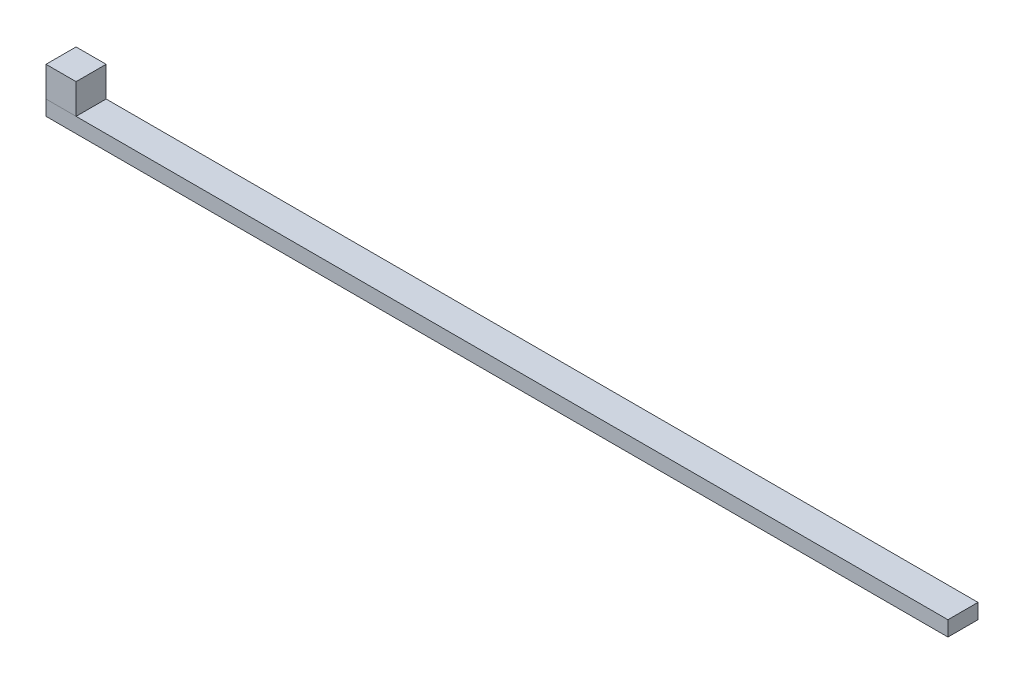
ISO-10303-21;
HEADER;
FILE_DESCRIPTION(('STEP AP214'),'2;1');
FILE_NAME('part.step','',(''),(''),'','','');
FILE_SCHEMA(('AUTOMOTIVE_DESIGN { 1 0 10303 214 1 1 1 1 }'));
ENDSEC;
DATA;
#1=APPLICATION_CONTEXT('core data for automotive mechanical design processes');
#2=APPLICATION_PROTOCOL_DEFINITION('international standard','automotive_design',2000,#1);
#3=PRODUCT_CONTEXT('',#1,'mechanical');
#4=PRODUCT('Part','Part','',(#3));
#5=PRODUCT_RELATED_PRODUCT_CATEGORY('part','',(#4));
#6=PRODUCT_DEFINITION_FORMATION('','',#4);
#7=PRODUCT_DEFINITION_CONTEXT('part definition',#1,'design');
#8=PRODUCT_DEFINITION('design','',#6,#7);
#9=PRODUCT_DEFINITION_SHAPE('','',#8);
#10=(LENGTH_UNIT() NAMED_UNIT(*) SI_UNIT(.MILLI.,.METRE.));
#11=(NAMED_UNIT(*) PLANE_ANGLE_UNIT() SI_UNIT($,.RADIAN.));
#12=(NAMED_UNIT(*) SI_UNIT($,.STERADIAN.) SOLID_ANGLE_UNIT());
#13=UNCERTAINTY_MEASURE_WITH_UNIT(LENGTH_MEASURE(1.E-05),#10,'distance_accuracy_value','');
#14=(GEOMETRIC_REPRESENTATION_CONTEXT(3) GLOBAL_UNCERTAINTY_ASSIGNED_CONTEXT((#13)) GLOBAL_UNIT_ASSIGNED_CONTEXT((#10,
#11,#12)) REPRESENTATION_CONTEXT('',''));
#15=CARTESIAN_POINT('',(0.,0.,0.));
#16=DIRECTION('',(0.,0.,1.));
#17=DIRECTION('',(1.,0.,0.));
#18=AXIS2_PLACEMENT_3D('',#15,#16,#17);
#19=CARTESIAN_POINT('',(0.,0.,100.));
#20=DIRECTION('',(0.,1.,0.));
#21=DIRECTION('',(0.,0.,1.));
#22=AXIS2_PLACEMENT_3D('',#19,#20,#21);
#23=PLANE('',#22);
#24=DIRECTION('',(1.,0.,0.));
#25=VECTOR('',#24,1.);
#26=CARTESIAN_POINT('',(0.,0.,0.));
#27=LINE('',#26,#25);
#28=CARTESIAN_POINT('',(0.,0.,0.));
#29=VERTEX_POINT('',#28);
#30=CARTESIAN_POINT('',(100.,0.,0.));
#31=VERTEX_POINT('',#30);
#32=EDGE_CURVE('E116',#29,#31,#27,.T.);
#33=ORIENTED_EDGE('',*,*,#32,.T.);
#34=DIRECTION('',(0.,0.,-1.));
#35=VECTOR('',#34,1.);
#36=CARTESIAN_POINT('',(100.,0.,100.));
#37=LINE('',#36,#35);
#38=CARTESIAN_POINT('',(100.,0.,100.));
#39=VERTEX_POINT('',#38);
#40=EDGE_CURVE('E12',#39,#31,#37,.T.);
#41=ORIENTED_EDGE('',*,*,#40,.F.);
#42=DIRECTION('',(1.,0.,0.));
#43=VECTOR('',#42,1.);
#44=CARTESIAN_POINT('',(0.,0.,100.));
#45=LINE('',#44,#43);
#46=CARTESIAN_POINT('',(0.,0.,100.));
#47=VERTEX_POINT('',#46);
#48=EDGE_CURVE('E102',#47,#39,#45,.T.);
#49=ORIENTED_EDGE('',*,*,#48,.F.);
#50=DIRECTION('',(0.,0.,-1.));
#51=VECTOR('',#50,1.);
#52=CARTESIAN_POINT('',(0.,0.,100.));
#53=LINE('',#52,#51);
#54=EDGE_CURVE('E69',#47,#29,#53,.T.);
#55=ORIENTED_EDGE('',*,*,#54,.T.);
#56=EDGE_LOOP('',(#33,#41,#49,#55));
#57=FACE_BOUND('',#56,.T.);
#58=ADVANCED_FACE('F53',(#57),#23,.F.);
#59=CARTESIAN_POINT('',(100.,0.,100.));
#60=DIRECTION('',(-1.,0.,0.));
#61=DIRECTION('',(0.,0.,1.));
#62=AXIS2_PLACEMENT_3D('',#59,#60,#61);
#63=PLANE('',#62);
#64=DIRECTION('',(0.,1.,0.));
#65=VECTOR('',#64,1.);
#66=CARTESIAN_POINT('',(100.,0.,0.));
#67=LINE('',#66,#65);
#68=CARTESIAN_POINT('',(100.,100.,0.));
#69=VERTEX_POINT('',#68);
#70=EDGE_CURVE('E107',#31,#69,#67,.T.);
#71=ORIENTED_EDGE('',*,*,#70,.T.);
#72=DIRECTION('',(0.,0.,-1.));
#73=VECTOR('',#72,1.);
#74=CARTESIAN_POINT('',(100.,100.,100.));
#75=LINE('',#74,#73);
#76=CARTESIAN_POINT('',(100.,100.,100.));
#77=VERTEX_POINT('',#76);
#78=EDGE_CURVE('E61',#77,#69,#75,.T.);
#79=ORIENTED_EDGE('',*,*,#78,.F.);
#80=DIRECTION('',(0.,1.,0.));
#81=VECTOR('',#80,1.);
#82=CARTESIAN_POINT('',(100.,0.,100.));
#83=LINE('',#82,#81);
#84=EDGE_CURVE('E94',#39,#77,#83,.T.);
#85=ORIENTED_EDGE('',*,*,#84,.F.);
#86=ORIENTED_EDGE('',*,*,#40,.T.);
#87=EDGE_LOOP('',(#71,#79,#85,#86));
#88=FACE_BOUND('',#87,.T.);
#89=ADVANCED_FACE('F106',(#88),#63,.F.);
#90=CARTESIAN_POINT('',(0.,100.,100.));
#91=DIRECTION('',(0.,1.,0.));
#92=DIRECTION('',(0.,0.,1.));
#93=AXIS2_PLACEMENT_3D('',#90,#91,#92);
#94=PLANE('',#93);
#95=DIRECTION('',(1.,0.,0.));
#96=VECTOR('',#95,1.);
#97=CARTESIAN_POINT('',(0.,100.,0.));
#98=LINE('',#97,#96);
#99=CARTESIAN_POINT('',(0.,100.,0.));
#100=VERTEX_POINT('',#99);
#101=EDGE_CURVE('E119',#100,#69,#98,.T.);
#102=ORIENTED_EDGE('',*,*,#101,.F.);
#103=DIRECTION('',(0.,0.,-1.));
#104=VECTOR('',#103,1.);
#105=CARTESIAN_POINT('',(0.,100.,100.));
#106=LINE('',#105,#104);
#107=CARTESIAN_POINT('',(0.,100.,100.));
#108=VERTEX_POINT('',#107);
#109=EDGE_CURVE('E83',#108,#100,#106,.T.);
#110=ORIENTED_EDGE('',*,*,#109,.F.);
#111=DIRECTION('',(1.,0.,0.));
#112=VECTOR('',#111,1.);
#113=CARTESIAN_POINT('',(0.,100.,100.));
#114=LINE('',#113,#112);
#115=EDGE_CURVE('E101',#108,#77,#114,.T.);
#116=ORIENTED_EDGE('',*,*,#115,.T.);
#117=ORIENTED_EDGE('',*,*,#78,.T.);
#118=EDGE_LOOP('',(#102,#110,#116,#117));
#119=FACE_BOUND('',#118,.T.);
#120=ADVANCED_FACE('F110',(#119),#94,.T.);
#121=CARTESIAN_POINT('',(0.,0.,100.));
#122=DIRECTION('',(-1.,0.,0.));
#123=DIRECTION('',(0.,0.,1.));
#124=AXIS2_PLACEMENT_3D('',#121,#122,#123);
#125=PLANE('',#124);
#126=DIRECTION('',(0.,1.,0.));
#127=VECTOR('',#126,1.);
#128=CARTESIAN_POINT('',(0.,0.,0.));
#129=LINE('',#128,#127);
#130=EDGE_CURVE('E121',#29,#100,#129,.T.);
#131=ORIENTED_EDGE('',*,*,#130,.F.);
#132=ORIENTED_EDGE('',*,*,#54,.F.);
#133=DIRECTION('',(0.,1.,0.));
#134=VECTOR('',#133,1.);
#135=CARTESIAN_POINT('',(0.,0.,100.));
#136=LINE('',#135,#134);
#137=EDGE_CURVE('E111',#47,#108,#136,.T.);
#138=ORIENTED_EDGE('',*,*,#137,.T.);
#139=ORIENTED_EDGE('',*,*,#109,.T.);
#140=EDGE_LOOP('',(#131,#132,#138,#139));
#141=FACE_BOUND('',#140,.T.);
#142=ADVANCED_FACE('F127',(#141),#125,.T.);
#143=CARTESIAN_POINT('',(0.,0.,100.));
#144=DIRECTION('',(0.,0.,1.));
#145=DIRECTION('',(1.,0.,0.));
#146=AXIS2_PLACEMENT_3D('',#143,#144,#145);
#147=PLANE('',#146);
#148=ORIENTED_EDGE('',*,*,#48,.T.);
#149=ORIENTED_EDGE('',*,*,#84,.T.);
#150=ORIENTED_EDGE('',*,*,#115,.F.);
#151=ORIENTED_EDGE('',*,*,#137,.F.);
#152=EDGE_LOOP('',(#148,#149,#150,#151));
#153=FACE_BOUND('',#152,.T.);
#154=ADVANCED_FACE('F98',(#153),#147,.T.);
#155=CARTESIAN_POINT('',(0.,0.,0.));
#156=DIRECTION('',(0.,0.,1.));
#157=DIRECTION('',(1.,0.,0.));
#158=AXIS2_PLACEMENT_3D('',#155,#156,#157);
#159=PLANE('',#158);
#160=ORIENTED_EDGE('',*,*,#32,.F.);
#161=ORIENTED_EDGE('',*,*,#130,.T.);
#162=ORIENTED_EDGE('',*,*,#101,.T.);
#163=ORIENTED_EDGE('',*,*,#70,.F.);
#164=EDGE_LOOP('',(#160,#161,#162,#163));
#165=FACE_BOUND('',#164,.T.);
#166=ADVANCED_FACE('F126',(#165),#159,.F.);
#167=CLOSED_SHELL('',(#58,#89,#120,#142,#154,#166));
#168=MANIFOLD_SOLID_BREP('B2',#167);
#169=CARTESIAN_POINT('',(3000.,0.,100.));
#170=DIRECTION('',(1.,0.,0.));
#171=DIRECTION('',(0.,0.,-1.));
#172=AXIS2_PLACEMENT_3D('',#169,#170,#171);
#173=PLANE('',#172);
#174=DIRECTION('',(0.,-1.,0.));
#175=VECTOR('',#174,1.);
#176=CARTESIAN_POINT('',(3000.,0.,0.));
#177=LINE('',#176,#175);
#178=CARTESIAN_POINT('',(3000.,0.,0.));
#179=VERTEX_POINT('',#178);
#180=CARTESIAN_POINT('',(3000.,-50.,0.));
#181=VERTEX_POINT('',#180);
#182=EDGE_CURVE('E246',#179,#181,#177,.T.);
#183=ORIENTED_EDGE('',*,*,#182,.F.);
#184=DIRECTION('',(0.,0.,-1.));
#185=VECTOR('',#184,1.);
#186=CARTESIAN_POINT('',(3000.,0.,100.));
#187=LINE('',#186,#185);
#188=CARTESIAN_POINT('',(3000.,0.,100.));
#189=VERTEX_POINT('',#188);
#190=EDGE_CURVE('E51',#189,#179,#187,.T.);
#191=ORIENTED_EDGE('',*,*,#190,.F.);
#192=DIRECTION('',(0.,-1.,0.));
#193=VECTOR('',#192,1.);
#194=CARTESIAN_POINT('',(3000.,0.,100.));
#195=LINE('',#194,#193);
#196=CARTESIAN_POINT('',(3000.,-50.,100.));
#197=VERTEX_POINT('',#196);
#198=EDGE_CURVE('E240',#189,#197,#195,.T.);
#199=ORIENTED_EDGE('',*,*,#198,.T.);
#200=DIRECTION('',(0.,0.,-1.));
#201=VECTOR('',#200,1.);
#202=CARTESIAN_POINT('',(3000.,-50.,100.));
#203=LINE('',#202,#201);
#204=EDGE_CURVE('E221',#197,#181,#203,.T.);
#205=ORIENTED_EDGE('',*,*,#204,.T.);
#206=EDGE_LOOP('',(#183,#191,#199,#205));
#207=FACE_BOUND('',#206,.T.);
#208=ADVANCED_FACE('F183',(#207),#173,.T.);
#209=CARTESIAN_POINT('',(0.,0.,100.));
#210=DIRECTION('',(0.,1.,0.));
#211=DIRECTION('',(0.,0.,1.));
#212=AXIS2_PLACEMENT_3D('',#209,#210,#211);
#213=PLANE('',#212);
#214=DIRECTION('',(1.,0.,0.));
#215=VECTOR('',#214,1.);
#216=CARTESIAN_POINT('',(0.,0.,0.));
#217=LINE('',#216,#215);
#218=CARTESIAN_POINT('',(0.,0.,0.));
#219=VERTEX_POINT('',#218);
#220=EDGE_CURVE('E234',#219,#179,#217,.T.);
#221=ORIENTED_EDGE('',*,*,#220,.F.);
#222=DIRECTION('',(0.,0.,-1.));
#223=VECTOR('',#222,1.);
#224=CARTESIAN_POINT('',(0.,0.,100.));
#225=LINE('',#224,#223);
#226=CARTESIAN_POINT('',(0.,0.,100.));
#227=VERTEX_POINT('',#226);
#228=EDGE_CURVE('E191',#227,#219,#225,.T.);
#229=ORIENTED_EDGE('',*,*,#228,.F.);
#230=DIRECTION('',(1.,0.,0.));
#231=VECTOR('',#230,1.);
#232=CARTESIAN_POINT('',(0.,0.,100.));
#233=LINE('',#232,#231);
#234=EDGE_CURVE('E232',#227,#189,#233,.T.);
#235=ORIENTED_EDGE('',*,*,#234,.T.);
#236=ORIENTED_EDGE('',*,*,#190,.T.);
#237=EDGE_LOOP('',(#221,#229,#235,#236));
#238=FACE_BOUND('',#237,.T.);
#239=ADVANCED_FACE('F230',(#238),#213,.T.);
#240=CARTESIAN_POINT('',(0.,0.,100.));
#241=DIRECTION('',(1.,0.,0.));
#242=DIRECTION('',(0.,0.,-1.));
#243=AXIS2_PLACEMENT_3D('',#240,#241,#242);
#244=PLANE('',#243);
#245=DIRECTION('',(0.,-1.,0.));
#246=VECTOR('',#245,1.);
#247=CARTESIAN_POINT('',(0.,0.,0.));
#248=LINE('',#247,#246);
#249=CARTESIAN_POINT('',(0.,-50.,0.));
#250=VERTEX_POINT('',#249);
#251=EDGE_CURVE('E214',#219,#250,#248,.T.);
#252=ORIENTED_EDGE('',*,*,#251,.T.);
#253=DIRECTION('',(0.,0.,-1.));
#254=VECTOR('',#253,1.);
#255=CARTESIAN_POINT('',(0.,-50.,100.));
#256=LINE('',#255,#254);
#257=CARTESIAN_POINT('',(0.,-50.,100.));
#258=VERTEX_POINT('',#257);
#259=EDGE_CURVE('E235',#258,#250,#256,.T.);
#260=ORIENTED_EDGE('',*,*,#259,.F.);
#261=DIRECTION('',(0.,-1.,0.));
#262=VECTOR('',#261,1.);
#263=CARTESIAN_POINT('',(0.,0.,100.));
#264=LINE('',#263,#262);
#265=EDGE_CURVE('E236',#227,#258,#264,.T.);
#266=ORIENTED_EDGE('',*,*,#265,.F.);
#267=ORIENTED_EDGE('',*,*,#228,.T.);
#268=EDGE_LOOP('',(#252,#260,#266,#267));
#269=FACE_BOUND('',#268,.T.);
#270=ADVANCED_FACE('F237',(#269),#244,.F.);
#271=CARTESIAN_POINT('',(0.,-50.,100.));
#272=DIRECTION('',(0.,1.,0.));
#273=DIRECTION('',(0.,0.,1.));
#274=AXIS2_PLACEMENT_3D('',#271,#272,#273);
#275=PLANE('',#274);
#276=DIRECTION('',(1.,0.,0.));
#277=VECTOR('',#276,1.);
#278=CARTESIAN_POINT('',(0.,-50.,0.));
#279=LINE('',#278,#277);
#280=EDGE_CURVE('E242',#250,#181,#279,.T.);
#281=ORIENTED_EDGE('',*,*,#280,.T.);
#282=ORIENTED_EDGE('',*,*,#204,.F.);
#283=DIRECTION('',(1.,0.,0.));
#284=VECTOR('',#283,1.);
#285=CARTESIAN_POINT('',(0.,-50.,100.));
#286=LINE('',#285,#284);
#287=EDGE_CURVE('E199',#258,#197,#286,.T.);
#288=ORIENTED_EDGE('',*,*,#287,.F.);
#289=ORIENTED_EDGE('',*,*,#259,.T.);
#290=EDGE_LOOP('',(#281,#282,#288,#289));
#291=FACE_BOUND('',#290,.T.);
#292=ADVANCED_FACE('F255',(#291),#275,.F.);
#293=CARTESIAN_POINT('',(0.,0.,100.));
#294=DIRECTION('',(0.,0.,1.));
#295=DIRECTION('',(1.,0.,0.));
#296=AXIS2_PLACEMENT_3D('',#293,#294,#295);
#297=PLANE('',#296);
#298=ORIENTED_EDGE('',*,*,#198,.F.);
#299=ORIENTED_EDGE('',*,*,#234,.F.);
#300=ORIENTED_EDGE('',*,*,#265,.T.);
#301=ORIENTED_EDGE('',*,*,#287,.T.);
#302=EDGE_LOOP('',(#298,#299,#300,#301));
#303=FACE_BOUND('',#302,.T.);
#304=ADVANCED_FACE('F239',(#303),#297,.T.);
#305=CARTESIAN_POINT('',(0.,0.,0.));
#306=DIRECTION('',(0.,0.,1.));
#307=DIRECTION('',(1.,0.,0.));
#308=AXIS2_PLACEMENT_3D('',#305,#306,#307);
#309=PLANE('',#308);
#310=ORIENTED_EDGE('',*,*,#182,.T.);
#311=ORIENTED_EDGE('',*,*,#280,.F.);
#312=ORIENTED_EDGE('',*,*,#251,.F.);
#313=ORIENTED_EDGE('',*,*,#220,.T.);
#314=EDGE_LOOP('',(#310,#311,#312,#313));
#315=FACE_BOUND('',#314,.T.);
#316=ADVANCED_FACE('F257',(#315),#309,.F.);
#317=CLOSED_SHELL('',(#208,#239,#270,#292,#304,#316));
#318=MANIFOLD_SOLID_BREP('B6',#317);
#319=ADVANCED_BREP_SHAPE_REPRESENTATION('',(#18,#168,#318),#14);
#320=SHAPE_DEFINITION_REPRESENTATION(#9,#319);
ENDSEC;
END-ISO-10303-21;
